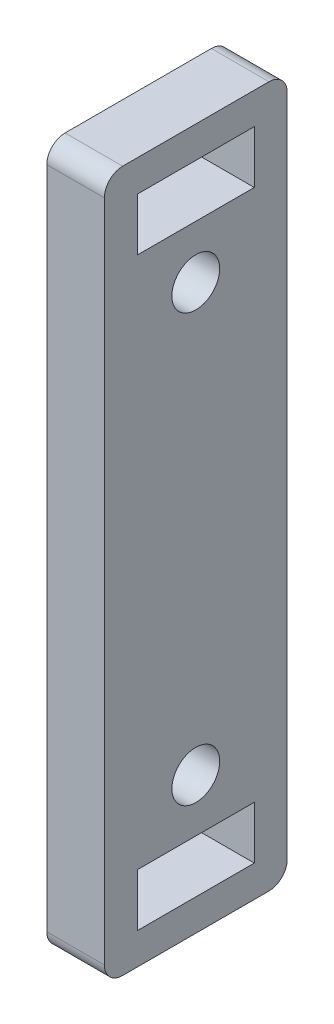
ISO-10303-21;
HEADER;
FILE_DESCRIPTION(('STEP AP214'),'2;1');
FILE_NAME('part.step','',(''),(''),'','','');
FILE_SCHEMA(('AUTOMOTIVE_DESIGN { 1 0 10303 214 1 1 1 1 }'));
ENDSEC;
DATA;
#1=APPLICATION_CONTEXT('core data for automotive mechanical design processes');
#2=APPLICATION_PROTOCOL_DEFINITION('international standard','automotive_design',2000,#1);
#3=PRODUCT_CONTEXT('',#1,'mechanical');
#4=PRODUCT('Part','Part','',(#3));
#5=PRODUCT_RELATED_PRODUCT_CATEGORY('part','',(#4));
#6=PRODUCT_DEFINITION_FORMATION('','',#4);
#7=PRODUCT_DEFINITION_CONTEXT('part definition',#1,'design');
#8=PRODUCT_DEFINITION('design','',#6,#7);
#9=PRODUCT_DEFINITION_SHAPE('','',#8);
#10=(LENGTH_UNIT() NAMED_UNIT(*) SI_UNIT(.MILLI.,.METRE.));
#11=(NAMED_UNIT(*) PLANE_ANGLE_UNIT() SI_UNIT($,.RADIAN.));
#12=(NAMED_UNIT(*) SI_UNIT($,.STERADIAN.) SOLID_ANGLE_UNIT());
#13=UNCERTAINTY_MEASURE_WITH_UNIT(LENGTH_MEASURE(1.E-05),#10,'distance_accuracy_value','');
#14=(GEOMETRIC_REPRESENTATION_CONTEXT(3) GLOBAL_UNCERTAINTY_ASSIGNED_CONTEXT((#13)) GLOBAL_UNIT_ASSIGNED_CONTEXT((#10,
#11,#12)) REPRESENTATION_CONTEXT('',''));
#15=CARTESIAN_POINT('',(0.,0.,0.));
#16=DIRECTION('',(0.,0.,1.));
#17=DIRECTION('',(1.,0.,0.));
#18=AXIS2_PLACEMENT_3D('',#15,#16,#17);
#19=CARTESIAN_POINT('',(1.5,-18.25625,4.7625));
#20=DIRECTION('',(0.,0.,-1.));
#21=DIRECTION('',(-1.,0.,0.));
#22=AXIS2_PLACEMENT_3D('',#19,#20,#21);
#23=PLANE('',#22);
#24=DIRECTION('',(0.,-1.,0.));
#25=VECTOR('',#24,1.);
#26=CARTESIAN_POINT('',(-1.5,-18.25625,4.7625));
#27=LINE('',#26,#25);
#28=CARTESIAN_POINT('',(-1.5,17.30375,4.7625));
#29=VERTEX_POINT('',#28);
#30=CARTESIAN_POINT('',(-1.5,-17.30375,4.7625));
#31=VERTEX_POINT('',#30);
#32=EDGE_CURVE('E250',#29,#31,#27,.T.);
#33=ORIENTED_EDGE('',*,*,#32,.T.);
#34=DIRECTION('',(-1.,0.,0.));
#35=VECTOR('',#34,1.);
#36=CARTESIAN_POINT('',(1.5,-17.30375,4.7625));
#37=LINE('',#36,#35);
#38=CARTESIAN_POINT('',(1.5,-17.30375,4.7625));
#39=VERTEX_POINT('',#38);
#40=EDGE_CURVE('E11',#31,#39,#37,.F.);
#41=ORIENTED_EDGE('',*,*,#40,.T.);
#42=DIRECTION('',(0.,-1.,0.));
#43=VECTOR('',#42,1.);
#44=CARTESIAN_POINT('',(1.5,-18.25625,4.7625));
#45=LINE('',#44,#43);
#46=CARTESIAN_POINT('',(1.5,17.30375,4.7625));
#47=VERTEX_POINT('',#46);
#48=EDGE_CURVE('E266',#47,#39,#45,.T.);
#49=ORIENTED_EDGE('',*,*,#48,.F.);
#50=DIRECTION('',(-1.,0.,0.));
#51=VECTOR('',#50,1.);
#52=CARTESIAN_POINT('',(1.5,17.30375,4.7625));
#53=LINE('',#52,#51);
#54=EDGE_CURVE('E54',#47,#29,#53,.T.);
#55=ORIENTED_EDGE('',*,*,#54,.T.);
#56=EDGE_LOOP('',(#33,#41,#49,#55));
#57=FACE_BOUND('',#56,.T.);
#58=ADVANCED_FACE('F45',(#57),#23,.F.);
#59=CARTESIAN_POINT('',(1.5,-18.25625,-4.7625));
#60=DIRECTION('',(0.,1.,0.));
#61=DIRECTION('',(0.,0.,1.));
#62=AXIS2_PLACEMENT_3D('',#59,#60,#61);
#63=PLANE('',#62);
#64=DIRECTION('',(0.,0.,-1.));
#65=VECTOR('',#64,1.);
#66=CARTESIAN_POINT('',(-1.5,-18.25625,-4.7625));
#67=LINE('',#66,#65);
#68=CARTESIAN_POINT('',(-1.5,-18.25625,3.81));
#69=VERTEX_POINT('',#68);
#70=CARTESIAN_POINT('',(-1.5,-18.25625,-3.81));
#71=VERTEX_POINT('',#70);
#72=EDGE_CURVE('E287',#69,#71,#67,.T.);
#73=ORIENTED_EDGE('',*,*,#72,.T.);
#74=DIRECTION('',(-1.,0.,0.));
#75=VECTOR('',#74,1.);
#76=CARTESIAN_POINT('',(1.5,-18.25625,-3.81));
#77=LINE('',#76,#75);
#78=CARTESIAN_POINT('',(1.5,-18.25625,-3.81));
#79=VERTEX_POINT('',#78);
#80=EDGE_CURVE('E339',#71,#79,#77,.F.);
#81=ORIENTED_EDGE('',*,*,#80,.T.);
#82=DIRECTION('',(0.,0.,-1.));
#83=VECTOR('',#82,1.);
#84=CARTESIAN_POINT('',(1.5,-18.25625,-4.7625));
#85=LINE('',#84,#83);
#86=CARTESIAN_POINT('',(1.5,-18.25625,3.81));
#87=VERTEX_POINT('',#86);
#88=EDGE_CURVE('E270',#87,#79,#85,.T.);
#89=ORIENTED_EDGE('',*,*,#88,.F.);
#90=DIRECTION('',(-1.,0.,0.));
#91=VECTOR('',#90,1.);
#92=CARTESIAN_POINT('',(1.5,-18.25625,3.81));
#93=LINE('',#92,#91);
#94=EDGE_CURVE('E335',#87,#69,#93,.T.);
#95=ORIENTED_EDGE('',*,*,#94,.T.);
#96=EDGE_LOOP('',(#73,#81,#89,#95));
#97=FACE_BOUND('',#96,.T.);
#98=ADVANCED_FACE('F359',(#97),#63,.F.);
#99=CARTESIAN_POINT('',(1.5,-18.25625,-4.7625));
#100=DIRECTION('',(0.,0.,1.));
#101=DIRECTION('',(1.,0.,0.));
#102=AXIS2_PLACEMENT_3D('',#99,#100,#101);
#103=PLANE('',#102);
#104=DIRECTION('',(0.,1.,0.));
#105=VECTOR('',#104,1.);
#106=CARTESIAN_POINT('',(-1.5,-18.25625,-4.7625));
#107=LINE('',#106,#105);
#108=CARTESIAN_POINT('',(-1.5,-17.30375,-4.7625));
#109=VERTEX_POINT('',#108);
#110=CARTESIAN_POINT('',(-1.5,17.30375,-4.7625));
#111=VERTEX_POINT('',#110);
#112=EDGE_CURVE('E291',#109,#111,#107,.T.);
#113=ORIENTED_EDGE('',*,*,#112,.T.);
#114=DIRECTION('',(-1.,0.,0.));
#115=VECTOR('',#114,1.);
#116=CARTESIAN_POINT('',(1.5,17.30375,-4.7625));
#117=LINE('',#116,#115);
#118=CARTESIAN_POINT('',(1.5,17.30375,-4.7625));
#119=VERTEX_POINT('',#118);
#120=EDGE_CURVE('E320',#111,#119,#117,.F.);
#121=ORIENTED_EDGE('',*,*,#120,.T.);
#122=DIRECTION('',(0.,1.,0.));
#123=VECTOR('',#122,1.);
#124=CARTESIAN_POINT('',(1.5,-18.25625,-4.7625));
#125=LINE('',#124,#123);
#126=CARTESIAN_POINT('',(1.5,-17.30375,-4.7625));
#127=VERTEX_POINT('',#126);
#128=EDGE_CURVE('E275',#127,#119,#125,.T.);
#129=ORIENTED_EDGE('',*,*,#128,.F.);
#130=DIRECTION('',(-1.,0.,0.));
#131=VECTOR('',#130,1.);
#132=CARTESIAN_POINT('',(1.5,-17.30375,-4.7625));
#133=LINE('',#132,#131);
#134=EDGE_CURVE('E316',#127,#109,#133,.T.);
#135=ORIENTED_EDGE('',*,*,#134,.T.);
#136=EDGE_LOOP('',(#113,#121,#129,#135));
#137=FACE_BOUND('',#136,.T.);
#138=ADVANCED_FACE('F370',(#137),#103,.F.);
#139=CARTESIAN_POINT('',(1.5,18.25625,-4.7625));
#140=DIRECTION('',(0.,-1.,0.));
#141=DIRECTION('',(0.,0.,-1.));
#142=AXIS2_PLACEMENT_3D('',#139,#140,#141);
#143=PLANE('',#142);
#144=DIRECTION('',(0.,0.,1.));
#145=VECTOR('',#144,1.);
#146=CARTESIAN_POINT('',(1.5,18.25625,-4.7625));
#147=LINE('',#146,#145);
#148=CARTESIAN_POINT('',(1.5,18.25625,-3.81));
#149=VERTEX_POINT('',#148);
#150=CARTESIAN_POINT('',(1.5,18.25625,3.81));
#151=VERTEX_POINT('',#150);
#152=EDGE_CURVE('E279',#149,#151,#147,.T.);
#153=ORIENTED_EDGE('',*,*,#152,.F.);
#154=DIRECTION('',(-1.,0.,0.));
#155=VECTOR('',#154,1.);
#156=CARTESIAN_POINT('',(1.5,18.25625,-3.81));
#157=LINE('',#156,#155);
#158=CARTESIAN_POINT('',(-1.5,18.25625,-3.81));
#159=VERTEX_POINT('',#158);
#160=EDGE_CURVE('E300',#149,#159,#157,.T.);
#161=ORIENTED_EDGE('',*,*,#160,.T.);
#162=DIRECTION('',(0.,0.,1.));
#163=VECTOR('',#162,1.);
#164=CARTESIAN_POINT('',(-1.5,18.25625,-4.7625));
#165=LINE('',#164,#163);
#166=CARTESIAN_POINT('',(-1.5,18.25625,3.81));
#167=VERTEX_POINT('',#166);
#168=EDGE_CURVE('E271',#159,#167,#165,.T.);
#169=ORIENTED_EDGE('',*,*,#168,.T.);
#170=DIRECTION('',(-1.,0.,0.));
#171=VECTOR('',#170,1.);
#172=CARTESIAN_POINT('',(1.5,18.25625,3.81));
#173=LINE('',#172,#171);
#174=EDGE_CURVE('E283',#167,#151,#173,.F.);
#175=ORIENTED_EDGE('',*,*,#174,.T.);
#176=EDGE_LOOP('',(#153,#161,#169,#175));
#177=FACE_BOUND('',#176,.T.);
#178=ADVANCED_FACE('F378',(#177),#143,.F.);
#179=CARTESIAN_POINT('',(1.5,0.,0.));
#180=DIRECTION('',(1.,0.,0.));
#181=DIRECTION('',(0.,0.,-1.));
#182=AXIS2_PLACEMENT_3D('',#179,#180,#181);
#183=PLANE('',#182);
#184=DIRECTION('',(0.,0.,1.));
#185=VECTOR('',#184,1.);
#186=CARTESIAN_POINT('',(1.5,-16.613,-3.048));
#187=LINE('',#186,#185);
#188=CARTESIAN_POINT('',(1.5,-16.613,-3.048));
#189=VERTEX_POINT('',#188);
#190=CARTESIAN_POINT('',(1.5,-16.613,3.048));
#191=VERTEX_POINT('',#190);
#192=EDGE_CURVE('E191',#189,#191,#187,.T.);
#193=ORIENTED_EDGE('',*,*,#192,.T.);
#194=DIRECTION('',(0.,1.,0.));
#195=VECTOR('',#194,1.);
#196=CARTESIAN_POINT('',(1.5,-16.613,3.048));
#197=LINE('',#196,#195);
#198=CARTESIAN_POINT('',(1.5,-13.867,3.048));
#199=VERTEX_POINT('',#198);
#200=EDGE_CURVE('E61',#191,#199,#197,.T.);
#201=ORIENTED_EDGE('',*,*,#200,.T.);
#202=DIRECTION('',(0.,0.,-1.));
#203=VECTOR('',#202,1.);
#204=CARTESIAN_POINT('',(1.5,-13.867,-3.048));
#205=LINE('',#204,#203);
#206=CARTESIAN_POINT('',(1.5,-13.867,-3.048));
#207=VERTEX_POINT('',#206);
#208=EDGE_CURVE('E178',#199,#207,#205,.T.);
#209=ORIENTED_EDGE('',*,*,#208,.T.);
#210=DIRECTION('',(0.,-1.,0.));
#211=VECTOR('',#210,1.);
#212=CARTESIAN_POINT('',(1.5,-16.613,-3.048));
#213=LINE('',#212,#211);
#214=EDGE_CURVE('E182',#207,#189,#213,.T.);
#215=ORIENTED_EDGE('',*,*,#214,.T.);
#216=EDGE_LOOP('',(#193,#201,#209,#215));
#217=FACE_BOUND('',#216,.T.);
#218=CARTESIAN_POINT('',(1.5,-11.1125,0.));
#219=DIRECTION('',(-1.,0.,0.));
#220=DIRECTION('',(0.,0.,-1.));
#221=AXIS2_PLACEMENT_3D('',#218,#219,#220);
#222=CIRCLE('',#221,1.246);
#223=CARTESIAN_POINT('',(1.5,-11.1125,-1.246));
#224=VERTEX_POINT('',#223);
#225=EDGE_CURVE('E210',#224,#224,#222,.T.);
#226=ORIENTED_EDGE('',*,*,#225,.T.);
#227=EDGE_LOOP('',(#226));
#228=FACE_BOUND('',#227,.T.);
#229=DIRECTION('',(0.,-1.,0.));
#230=VECTOR('',#229,1.);
#231=CARTESIAN_POINT('',(1.5,16.613,3.048));
#232=LINE('',#231,#230);
#233=CARTESIAN_POINT('',(1.5,16.613,3.048));
#234=VERTEX_POINT('',#233);
#235=CARTESIAN_POINT('',(1.5,13.867,3.048));
#236=VERTEX_POINT('',#235);
#237=EDGE_CURVE('E232',#234,#236,#232,.T.);
#238=ORIENTED_EDGE('',*,*,#237,.F.);
#239=DIRECTION('',(0.,0.,1.));
#240=VECTOR('',#239,1.);
#241=CARTESIAN_POINT('',(1.5,16.613,-3.048));
#242=LINE('',#241,#240);
#243=CARTESIAN_POINT('',(1.5,16.613,-3.048));
#244=VERTEX_POINT('',#243);
#245=EDGE_CURVE('E219',#244,#234,#242,.T.);
#246=ORIENTED_EDGE('',*,*,#245,.F.);
#247=DIRECTION('',(0.,1.,0.));
#248=VECTOR('',#247,1.);
#249=CARTESIAN_POINT('',(1.5,16.613,-3.048));
#250=LINE('',#249,#248);
#251=CARTESIAN_POINT('',(1.5,13.867,-3.048));
#252=VERTEX_POINT('',#251);
#253=EDGE_CURVE('E240',#252,#244,#250,.T.);
#254=ORIENTED_EDGE('',*,*,#253,.F.);
#255=DIRECTION('',(0.,0.,-1.));
#256=VECTOR('',#255,1.);
#257=CARTESIAN_POINT('',(1.5,13.867,-3.048));
#258=LINE('',#257,#256);
#259=EDGE_CURVE('E235',#236,#252,#258,.T.);
#260=ORIENTED_EDGE('',*,*,#259,.F.);
#261=EDGE_LOOP('',(#238,#246,#254,#260));
#262=FACE_BOUND('',#261,.T.);
#263=CARTESIAN_POINT('',(1.5,11.1125,0.));
#264=DIRECTION('',(1.,0.,0.));
#265=DIRECTION('',(0.,0.,-1.));
#266=AXIS2_PLACEMENT_3D('',#263,#264,#265);
#267=CIRCLE('',#266,1.246);
#268=CARTESIAN_POINT('',(1.5,11.1125,-1.246));
#269=VERTEX_POINT('',#268);
#270=EDGE_CURVE('E236',#269,#269,#267,.T.);
#271=ORIENTED_EDGE('',*,*,#270,.F.);
#272=EDGE_LOOP('',(#271));
#273=FACE_BOUND('',#272,.T.);
#274=ORIENTED_EDGE('',*,*,#128,.T.);
#275=CARTESIAN_POINT('',(1.5,17.30375,-3.81));
#276=DIRECTION('',(1.,0.,0.));
#277=DIRECTION('',(0.,0.,-1.));
#278=AXIS2_PLACEMENT_3D('',#275,#276,#277);
#279=CIRCLE('',#278,0.9525);
#280=EDGE_CURVE('E332',#119,#149,#279,.T.);
#281=ORIENTED_EDGE('',*,*,#280,.T.);
#282=ORIENTED_EDGE('',*,*,#152,.T.);
#283=CARTESIAN_POINT('',(1.5,17.30375,3.81));
#284=DIRECTION('',(1.,0.,0.));
#285=DIRECTION('',(0.,0.,-1.));
#286=AXIS2_PLACEMENT_3D('',#283,#284,#285);
#287=CIRCLE('',#286,0.9525);
#288=EDGE_CURVE('E323',#151,#47,#287,.T.);
#289=ORIENTED_EDGE('',*,*,#288,.T.);
#290=ORIENTED_EDGE('',*,*,#48,.T.);
#291=CARTESIAN_POINT('',(1.5,-17.30375,3.81));
#292=DIRECTION('',(1.,0.,0.));
#293=DIRECTION('',(0.,0.,-1.));
#294=AXIS2_PLACEMENT_3D('',#291,#292,#293);
#295=CIRCLE('',#294,0.9525);
#296=EDGE_CURVE('E326',#39,#87,#295,.T.);
#297=ORIENTED_EDGE('',*,*,#296,.T.);
#298=ORIENTED_EDGE('',*,*,#88,.T.);
#299=CARTESIAN_POINT('',(1.5,-17.30375,-3.81));
#300=DIRECTION('',(1.,0.,0.));
#301=DIRECTION('',(0.,0.,-1.));
#302=AXIS2_PLACEMENT_3D('',#299,#300,#301);
#303=CIRCLE('',#302,0.9525);
#304=EDGE_CURVE('E329',#79,#127,#303,.T.);
#305=ORIENTED_EDGE('',*,*,#304,.T.);
#306=EDGE_LOOP('',(#274,#281,#282,#289,#290,#297,#298,#305));
#307=FACE_BOUND('',#306,.T.);
#308=ADVANCED_FACE('F363',(#217,#228,#262,#273,#307),#183,.T.);
#309=CARTESIAN_POINT('',(-1.5,0.,0.));
#310=DIRECTION('',(1.,0.,0.));
#311=DIRECTION('',(0.,0.,-1.));
#312=AXIS2_PLACEMENT_3D('',#309,#310,#311);
#313=PLANE('',#312);
#314=DIRECTION('',(0.,1.,0.));
#315=VECTOR('',#314,1.);
#316=CARTESIAN_POINT('',(-1.5,-16.613,3.048));
#317=LINE('',#316,#315);
#318=CARTESIAN_POINT('',(-1.5,-16.613,3.048));
#319=VERTEX_POINT('',#318);
#320=CARTESIAN_POINT('',(-1.5,-13.867,3.048));
#321=VERTEX_POINT('',#320);
#322=EDGE_CURVE('E167',#319,#321,#317,.T.);
#323=ORIENTED_EDGE('',*,*,#322,.F.);
#324=DIRECTION('',(0.,0.,1.));
#325=VECTOR('',#324,1.);
#326=CARTESIAN_POINT('',(-1.5,-16.613,-3.048));
#327=LINE('',#326,#325);
#328=CARTESIAN_POINT('',(-1.5,-16.613,-3.048));
#329=VERTEX_POINT('',#328);
#330=EDGE_CURVE('E158',#329,#319,#327,.T.);
#331=ORIENTED_EDGE('',*,*,#330,.F.);
#332=DIRECTION('',(0.,-1.,0.));
#333=VECTOR('',#332,1.);
#334=CARTESIAN_POINT('',(-1.5,-16.613,-3.048));
#335=LINE('',#334,#333);
#336=CARTESIAN_POINT('',(-1.5,-13.867,-3.048));
#337=VERTEX_POINT('',#336);
#338=EDGE_CURVE('E166',#337,#329,#335,.T.);
#339=ORIENTED_EDGE('',*,*,#338,.F.);
#340=DIRECTION('',(0.,0.,-1.));
#341=VECTOR('',#340,1.);
#342=CARTESIAN_POINT('',(-1.5,-13.867,-3.048));
#343=LINE('',#342,#341);
#344=EDGE_CURVE('E172',#321,#337,#343,.T.);
#345=ORIENTED_EDGE('',*,*,#344,.F.);
#346=EDGE_LOOP('',(#323,#331,#339,#345));
#347=FACE_BOUND('',#346,.T.);
#348=CARTESIAN_POINT('',(-1.5,-11.1125,0.));
#349=DIRECTION('',(-1.,0.,0.));
#350=DIRECTION('',(0.,0.,-1.));
#351=AXIS2_PLACEMENT_3D('',#348,#349,#350);
#352=CIRCLE('',#351,1.246);
#353=CARTESIAN_POINT('',(-1.5,-11.1125,-1.246));
#354=VERTEX_POINT('',#353);
#355=EDGE_CURVE('E192',#354,#354,#352,.T.);
#356=ORIENTED_EDGE('',*,*,#355,.F.);
#357=EDGE_LOOP('',(#356));
#358=FACE_BOUND('',#357,.T.);
#359=DIRECTION('',(0.,0.,1.));
#360=VECTOR('',#359,1.);
#361=CARTESIAN_POINT('',(-1.5,16.613,-3.048));
#362=LINE('',#361,#360);
#363=CARTESIAN_POINT('',(-1.5,16.613,-3.048));
#364=VERTEX_POINT('',#363);
#365=CARTESIAN_POINT('',(-1.5,16.613,3.048));
#366=VERTEX_POINT('',#365);
#367=EDGE_CURVE('E227',#364,#366,#362,.T.);
#368=ORIENTED_EDGE('',*,*,#367,.T.);
#369=DIRECTION('',(0.,-1.,0.));
#370=VECTOR('',#369,1.);
#371=CARTESIAN_POINT('',(-1.5,16.613,3.048));
#372=LINE('',#371,#370);
#373=CARTESIAN_POINT('',(-1.5,13.867,3.048));
#374=VERTEX_POINT('',#373);
#375=EDGE_CURVE('E214',#366,#374,#372,.T.);
#376=ORIENTED_EDGE('',*,*,#375,.T.);
#377=DIRECTION('',(0.,0.,-1.));
#378=VECTOR('',#377,1.);
#379=CARTESIAN_POINT('',(-1.5,13.867,-3.048));
#380=LINE('',#379,#378);
#381=CARTESIAN_POINT('',(-1.5,13.867,-3.048));
#382=VERTEX_POINT('',#381);
#383=EDGE_CURVE('E218',#374,#382,#380,.T.);
#384=ORIENTED_EDGE('',*,*,#383,.T.);
#385=DIRECTION('',(0.,1.,0.));
#386=VECTOR('',#385,1.);
#387=CARTESIAN_POINT('',(-1.5,16.613,-3.048));
#388=LINE('',#387,#386);
#389=EDGE_CURVE('E223',#382,#364,#388,.T.);
#390=ORIENTED_EDGE('',*,*,#389,.T.);
#391=EDGE_LOOP('',(#368,#376,#384,#390));
#392=FACE_BOUND('',#391,.T.);
#393=CARTESIAN_POINT('',(-1.5,11.1125,0.));
#394=DIRECTION('',(1.,0.,0.));
#395=DIRECTION('',(0.,0.,-1.));
#396=AXIS2_PLACEMENT_3D('',#393,#394,#395);
#397=CIRCLE('',#396,1.246);
#398=CARTESIAN_POINT('',(-1.5,11.1125,-1.246));
#399=VERTEX_POINT('',#398);
#400=EDGE_CURVE('E201',#399,#399,#397,.T.);
#401=ORIENTED_EDGE('',*,*,#400,.T.);
#402=EDGE_LOOP('',(#401));
#403=FACE_BOUND('',#402,.T.);
#404=ORIENTED_EDGE('',*,*,#168,.F.);
#405=CARTESIAN_POINT('',(-1.5,17.30375,-3.81));
#406=DIRECTION('',(1.,0.,0.));
#407=DIRECTION('',(0.,0.,-1.));
#408=AXIS2_PLACEMENT_3D('',#405,#406,#407);
#409=CIRCLE('',#408,0.9525);
#410=EDGE_CURVE('E313',#159,#111,#409,.F.);
#411=ORIENTED_EDGE('',*,*,#410,.T.);
#412=ORIENTED_EDGE('',*,*,#112,.F.);
#413=CARTESIAN_POINT('',(-1.5,-17.30375,-3.81));
#414=DIRECTION('',(1.,0.,0.));
#415=DIRECTION('',(0.,0.,-1.));
#416=AXIS2_PLACEMENT_3D('',#413,#414,#415);
#417=CIRCLE('',#416,0.9525);
#418=EDGE_CURVE('E310',#109,#71,#417,.F.);
#419=ORIENTED_EDGE('',*,*,#418,.T.);
#420=ORIENTED_EDGE('',*,*,#72,.F.);
#421=CARTESIAN_POINT('',(-1.5,-17.30375,3.81));
#422=DIRECTION('',(1.,0.,0.));
#423=DIRECTION('',(0.,0.,-1.));
#424=AXIS2_PLACEMENT_3D('',#421,#422,#423);
#425=CIRCLE('',#424,0.9525);
#426=EDGE_CURVE('E307',#69,#31,#425,.F.);
#427=ORIENTED_EDGE('',*,*,#426,.T.);
#428=ORIENTED_EDGE('',*,*,#32,.F.);
#429=CARTESIAN_POINT('',(-1.5,17.30375,3.81));
#430=DIRECTION('',(1.,0.,0.));
#431=DIRECTION('',(0.,0.,-1.));
#432=AXIS2_PLACEMENT_3D('',#429,#430,#431);
#433=CIRCLE('',#432,0.9525);
#434=EDGE_CURVE('E304',#29,#167,#433,.F.);
#435=ORIENTED_EDGE('',*,*,#434,.T.);
#436=EDGE_LOOP('',(#404,#411,#412,#419,#420,#427,#428,#435));
#437=FACE_BOUND('',#436,.T.);
#438=ADVANCED_FACE('F175',(#347,#358,#392,#403,#437),#313,.F.);
#439=CARTESIAN_POINT('',(1.5,17.30375,-3.81));
#440=DIRECTION('',(-1.,0.,0.));
#441=DIRECTION('',(0.,0.,1.));
#442=AXIS2_PLACEMENT_3D('',#439,#440,#441);
#443=CYLINDRICAL_SURFACE('',#442,0.9525);
#444=ORIENTED_EDGE('',*,*,#280,.F.);
#445=ORIENTED_EDGE('',*,*,#120,.F.);
#446=ORIENTED_EDGE('',*,*,#410,.F.);
#447=ORIENTED_EDGE('',*,*,#160,.F.);
#448=EDGE_LOOP('',(#444,#445,#446,#447));
#449=FACE_BOUND('',#448,.T.);
#450=ADVANCED_FACE('F375',(#449),#443,.T.);
#451=CARTESIAN_POINT('',(1.5,-17.30375,-3.81));
#452=DIRECTION('',(-1.,0.,0.));
#453=DIRECTION('',(0.,0.,1.));
#454=AXIS2_PLACEMENT_3D('',#451,#452,#453);
#455=CYLINDRICAL_SURFACE('',#454,0.9525);
#456=ORIENTED_EDGE('',*,*,#304,.F.);
#457=ORIENTED_EDGE('',*,*,#80,.F.);
#458=ORIENTED_EDGE('',*,*,#418,.F.);
#459=ORIENTED_EDGE('',*,*,#134,.F.);
#460=EDGE_LOOP('',(#456,#457,#458,#459));
#461=FACE_BOUND('',#460,.T.);
#462=ADVANCED_FACE('F367',(#461),#455,.T.);
#463=CARTESIAN_POINT('',(1.5,-17.30375,3.81));
#464=DIRECTION('',(-1.,0.,0.));
#465=DIRECTION('',(0.,0.,1.));
#466=AXIS2_PLACEMENT_3D('',#463,#464,#465);
#467=CYLINDRICAL_SURFACE('',#466,0.9525);
#468=ORIENTED_EDGE('',*,*,#296,.F.);
#469=ORIENTED_EDGE('',*,*,#40,.F.);
#470=ORIENTED_EDGE('',*,*,#426,.F.);
#471=ORIENTED_EDGE('',*,*,#94,.F.);
#472=EDGE_LOOP('',(#468,#469,#470,#471));
#473=FACE_BOUND('',#472,.T.);
#474=ADVANCED_FACE('F356',(#473),#467,.T.);
#475=CARTESIAN_POINT('',(1.5,17.30375,3.81));
#476=DIRECTION('',(-1.,0.,0.));
#477=DIRECTION('',(0.,0.,1.));
#478=AXIS2_PLACEMENT_3D('',#475,#476,#477);
#479=CYLINDRICAL_SURFACE('',#478,0.9525);
#480=ORIENTED_EDGE('',*,*,#288,.F.);
#481=ORIENTED_EDGE('',*,*,#174,.F.);
#482=ORIENTED_EDGE('',*,*,#434,.F.);
#483=ORIENTED_EDGE('',*,*,#54,.F.);
#484=EDGE_LOOP('',(#480,#481,#482,#483));
#485=FACE_BOUND('',#484,.T.);
#486=ADVANCED_FACE('F47',(#485),#479,.T.);
#487=CARTESIAN_POINT('',(-1.5,11.1125,0.));
#488=DIRECTION('',(1.,0.,0.));
#489=DIRECTION('',(0.,0.,-1.));
#490=AXIS2_PLACEMENT_3D('',#487,#488,#489);
#491=CYLINDRICAL_SURFACE('',#490,1.246);
#492=ORIENTED_EDGE('',*,*,#400,.F.);
#493=EDGE_LOOP('',(#492));
#494=FACE_BOUND('',#493,.T.);
#495=ORIENTED_EDGE('',*,*,#270,.T.);
#496=EDGE_LOOP('',(#495));
#497=FACE_BOUND('',#496,.T.);
#498=ADVANCED_FACE('F381',(#494,#497),#491,.F.);
#499=CARTESIAN_POINT('',(-1.5,16.613,3.048));
#500=DIRECTION('',(0.,0.,1.));
#501=DIRECTION('',(0.,-1.,0.));
#502=AXIS2_PLACEMENT_3D('',#499,#500,#501);
#503=PLANE('',#502);
#504=ORIENTED_EDGE('',*,*,#237,.T.);
#505=DIRECTION('',(1.,0.,0.));
#506=VECTOR('',#505,1.);
#507=CARTESIAN_POINT('',(-1.5,13.867,3.048));
#508=LINE('',#507,#506);
#509=EDGE_CURVE('E231',#374,#236,#508,.T.);
#510=ORIENTED_EDGE('',*,*,#509,.F.);
#511=ORIENTED_EDGE('',*,*,#375,.F.);
#512=DIRECTION('',(1.,0.,0.));
#513=VECTOR('',#512,1.);
#514=CARTESIAN_POINT('',(-1.5,16.613,3.048));
#515=LINE('',#514,#513);
#516=EDGE_CURVE('E247',#366,#234,#515,.T.);
#517=ORIENTED_EDGE('',*,*,#516,.T.);
#518=EDGE_LOOP('',(#504,#510,#511,#517));
#519=FACE_BOUND('',#518,.T.);
#520=ADVANCED_FACE('F386',(#519),#503,.F.);
#521=CARTESIAN_POINT('',(-1.5,16.613,-3.048));
#522=DIRECTION('',(0.,1.,0.));
#523=DIRECTION('',(0.,0.,1.));
#524=AXIS2_PLACEMENT_3D('',#521,#522,#523);
#525=PLANE('',#524);
#526=ORIENTED_EDGE('',*,*,#245,.T.);
#527=ORIENTED_EDGE('',*,*,#516,.F.);
#528=ORIENTED_EDGE('',*,*,#367,.F.);
#529=DIRECTION('',(1.,0.,0.));
#530=VECTOR('',#529,1.);
#531=CARTESIAN_POINT('',(-1.5,16.613,-3.048));
#532=LINE('',#531,#530);
#533=EDGE_CURVE('E251',#364,#244,#532,.T.);
#534=ORIENTED_EDGE('',*,*,#533,.T.);
#535=EDGE_LOOP('',(#526,#527,#528,#534));
#536=FACE_BOUND('',#535,.T.);
#537=ADVANCED_FACE('F430',(#536),#525,.F.);
#538=CARTESIAN_POINT('',(-1.5,16.613,-3.048));
#539=DIRECTION('',(0.,0.,-1.));
#540=DIRECTION('',(0.,1.,0.));
#541=AXIS2_PLACEMENT_3D('',#538,#539,#540);
#542=PLANE('',#541);
#543=ORIENTED_EDGE('',*,*,#253,.T.);
#544=ORIENTED_EDGE('',*,*,#533,.F.);
#545=ORIENTED_EDGE('',*,*,#389,.F.);
#546=DIRECTION('',(1.,0.,0.));
#547=VECTOR('',#546,1.);
#548=CARTESIAN_POINT('',(-1.5,13.867,-3.048));
#549=LINE('',#548,#547);
#550=EDGE_CURVE('E254',#382,#252,#549,.T.);
#551=ORIENTED_EDGE('',*,*,#550,.T.);
#552=EDGE_LOOP('',(#543,#544,#545,#551));
#553=FACE_BOUND('',#552,.T.);
#554=ADVANCED_FACE('F440',(#553),#542,.F.);
#555=CARTESIAN_POINT('',(-1.5,13.867,-3.048));
#556=DIRECTION('',(0.,-1.,0.));
#557=DIRECTION('',(0.,0.,-1.));
#558=AXIS2_PLACEMENT_3D('',#555,#556,#557);
#559=PLANE('',#558);
#560=ORIENTED_EDGE('',*,*,#259,.T.);
#561=ORIENTED_EDGE('',*,*,#550,.F.);
#562=ORIENTED_EDGE('',*,*,#383,.F.);
#563=ORIENTED_EDGE('',*,*,#509,.T.);
#564=EDGE_LOOP('',(#560,#561,#562,#563));
#565=FACE_BOUND('',#564,.T.);
#566=ADVANCED_FACE('F450',(#565),#559,.F.);
#567=CARTESIAN_POINT('',(-1.5,-11.1125,0.));
#568=DIRECTION('',(1.,0.,0.));
#569=DIRECTION('',(0.,0.,-1.));
#570=AXIS2_PLACEMENT_3D('',#567,#568,#569);
#571=CYLINDRICAL_SURFACE('',#570,1.246);
#572=ORIENTED_EDGE('',*,*,#355,.T.);
#573=EDGE_LOOP('',(#572));
#574=FACE_BOUND('',#573,.T.);
#575=ORIENTED_EDGE('',*,*,#225,.F.);
#576=EDGE_LOOP('',(#575));
#577=FACE_BOUND('',#576,.T.);
#578=ADVANCED_FACE('F460',(#574,#577),#571,.F.);
#579=CARTESIAN_POINT('',(-1.5,-16.613,3.048));
#580=DIRECTION('',(0.,0.,-1.));
#581=DIRECTION('',(0.,1.,0.));
#582=AXIS2_PLACEMENT_3D('',#579,#580,#581);
#583=PLANE('',#582);
#584=ORIENTED_EDGE('',*,*,#200,.F.);
#585=DIRECTION('',(1.,0.,0.));
#586=VECTOR('',#585,1.);
#587=CARTESIAN_POINT('',(-1.5,-16.613,3.048));
#588=LINE('',#587,#586);
#589=EDGE_CURVE('E160',#319,#191,#588,.T.);
#590=ORIENTED_EDGE('',*,*,#589,.F.);
#591=ORIENTED_EDGE('',*,*,#322,.T.);
#592=DIRECTION('',(1.,0.,0.));
#593=VECTOR('',#592,1.);
#594=CARTESIAN_POINT('',(-1.5,-13.867,3.048));
#595=LINE('',#594,#593);
#596=EDGE_CURVE('E198',#321,#199,#595,.T.);
#597=ORIENTED_EDGE('',*,*,#596,.T.);
#598=EDGE_LOOP('',(#584,#590,#591,#597));
#599=FACE_BOUND('',#598,.T.);
#600=ADVANCED_FACE('F169',(#599),#583,.T.);
#601=CARTESIAN_POINT('',(-1.5,-13.867,-3.048));
#602=DIRECTION('',(0.,-1.,0.));
#603=DIRECTION('',(0.,0.,-1.));
#604=AXIS2_PLACEMENT_3D('',#601,#602,#603);
#605=PLANE('',#604);
#606=ORIENTED_EDGE('',*,*,#208,.F.);
#607=ORIENTED_EDGE('',*,*,#596,.F.);
#608=ORIENTED_EDGE('',*,*,#344,.T.);
#609=DIRECTION('',(1.,0.,0.));
#610=VECTOR('',#609,1.);
#611=CARTESIAN_POINT('',(-1.5,-13.867,-3.048));
#612=LINE('',#611,#610);
#613=EDGE_CURVE('E202',#337,#207,#612,.T.);
#614=ORIENTED_EDGE('',*,*,#613,.T.);
#615=EDGE_LOOP('',(#606,#607,#608,#614));
#616=FACE_BOUND('',#615,.T.);
#617=ADVANCED_FACE('F481',(#616),#605,.T.);
#618=CARTESIAN_POINT('',(-1.5,-16.613,-3.048));
#619=DIRECTION('',(0.,0.,1.));
#620=DIRECTION('',(0.,-1.,0.));
#621=AXIS2_PLACEMENT_3D('',#618,#619,#620);
#622=PLANE('',#621);
#623=ORIENTED_EDGE('',*,*,#214,.F.);
#624=ORIENTED_EDGE('',*,*,#613,.F.);
#625=ORIENTED_EDGE('',*,*,#338,.T.);
#626=DIRECTION('',(1.,0.,0.));
#627=VECTOR('',#626,1.);
#628=CARTESIAN_POINT('',(-1.5,-16.613,-3.048));
#629=LINE('',#628,#627);
#630=EDGE_CURVE('E69',#329,#189,#629,.T.);
#631=ORIENTED_EDGE('',*,*,#630,.T.);
#632=EDGE_LOOP('',(#623,#624,#625,#631));
#633=FACE_BOUND('',#632,.T.);
#634=ADVANCED_FACE('F490',(#633),#622,.T.);
#635=CARTESIAN_POINT('',(-1.5,-16.613,-3.048));
#636=DIRECTION('',(0.,1.,0.));
#637=DIRECTION('',(0.,0.,1.));
#638=AXIS2_PLACEMENT_3D('',#635,#636,#637);
#639=PLANE('',#638);
#640=ORIENTED_EDGE('',*,*,#192,.F.);
#641=ORIENTED_EDGE('',*,*,#630,.F.);
#642=ORIENTED_EDGE('',*,*,#330,.T.);
#643=ORIENTED_EDGE('',*,*,#589,.T.);
#644=EDGE_LOOP('',(#640,#641,#642,#643));
#645=FACE_BOUND('',#644,.T.);
#646=ADVANCED_FACE('F159',(#645),#639,.T.);
#647=CLOSED_SHELL('',(#58,#98,#138,#178,#308,#438,#450,#462,#474,#486,#498,#520,#537,#554,#566,
#578,#600,#617,#634,#646));
#648=MANIFOLD_SOLID_BREP('B2',#647);
#649=ADVANCED_BREP_SHAPE_REPRESENTATION('',(#18,#648),#14);
#650=SHAPE_DEFINITION_REPRESENTATION(#9,#649);
ENDSEC;
END-ISO-10303-21;
